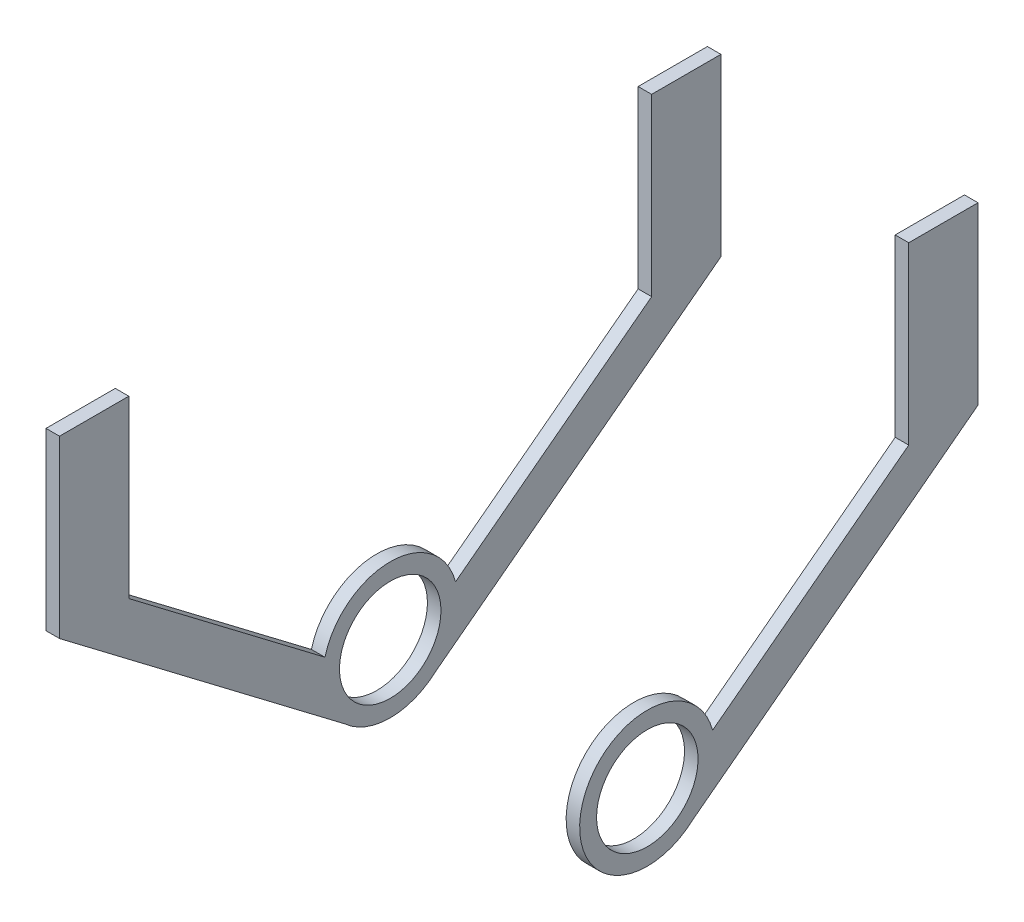
ISO-10303-21;
HEADER;
FILE_DESCRIPTION(('STEP AP214'),'2;1');
FILE_NAME('part.step','',(''),(''),'','','');
FILE_SCHEMA(('AUTOMOTIVE_DESIGN { 1 0 10303 214 1 1 1 1 }'));
ENDSEC;
DATA;
#1=APPLICATION_CONTEXT('core data for automotive mechanical design processes');
#2=APPLICATION_PROTOCOL_DEFINITION('international standard','automotive_design',2000,#1);
#3=PRODUCT_CONTEXT('',#1,'mechanical');
#4=PRODUCT('Part','Part','',(#3));
#5=PRODUCT_RELATED_PRODUCT_CATEGORY('part','',(#4));
#6=PRODUCT_DEFINITION_FORMATION('','',#4);
#7=PRODUCT_DEFINITION_CONTEXT('part definition',#1,'design');
#8=PRODUCT_DEFINITION('design','',#6,#7);
#9=PRODUCT_DEFINITION_SHAPE('','',#8);
#10=(LENGTH_UNIT() NAMED_UNIT(*) SI_UNIT(.MILLI.,.METRE.));
#11=(NAMED_UNIT(*) PLANE_ANGLE_UNIT() SI_UNIT($,.RADIAN.));
#12=(NAMED_UNIT(*) SI_UNIT($,.STERADIAN.) SOLID_ANGLE_UNIT());
#13=UNCERTAINTY_MEASURE_WITH_UNIT(LENGTH_MEASURE(1.E-05),#10,'distance_accuracy_value','');
#14=(GEOMETRIC_REPRESENTATION_CONTEXT(3) GLOBAL_UNCERTAINTY_ASSIGNED_CONTEXT((#13)) GLOBAL_UNIT_ASSIGNED_CONTEXT((#10,
#11,#12)) REPRESENTATION_CONTEXT('',''));
#15=CARTESIAN_POINT('',(0.,0.,0.));
#16=DIRECTION('',(0.,0.,1.));
#17=DIRECTION('',(1.,0.,0.));
#18=AXIS2_PLACEMENT_3D('',#15,#16,#17);
#19=CARTESIAN_POINT('',(190.,0.,1.32676290876039E-12));
#20=DIRECTION('',(1.,0.,0.));
#21=DIRECTION('',(0.,0.,-1.));
#22=AXIS2_PLACEMENT_3D('',#19,#20,#21);
#23=CYLINDRICAL_SURFACE('',#22,50.);
#24=DIRECTION('',(1.,0.,0.));
#25=VECTOR('',#24,1.);
#26=CARTESIAN_POINT('',(190.,12.9864956937927,-48.2840649655243));
#27=LINE('',#26,#25);
#28=CARTESIAN_POINT('',(190.,12.9864956937927,-48.2840649655243));
#29=VERTEX_POINT('',#28);
#30=CARTESIAN_POINT('',(200.,12.9864956937927,-48.2840649655243));
#31=VERTEX_POINT('',#30);
#32=EDGE_CURVE('E141',#29,#31,#27,.T.);
#33=ORIENTED_EDGE('',*,*,#32,.F.);
#34=CARTESIAN_POINT('',(190.,0.,1.32676290876039E-12));
#35=DIRECTION('',(-1.,0.,0.));
#36=DIRECTION('',(0.,0.,1.));
#37=AXIS2_PLACEMENT_3D('',#34,#35,#36);
#38=CIRCLE('',#37,50.);
#39=CARTESIAN_POINT('',(190.,-37.0135043062073,-33.6154800497373));
#40=VERTEX_POINT('',#39);
#41=EDGE_CURVE('E12',#40,#29,#38,.T.);
#42=ORIENTED_EDGE('',*,*,#41,.F.);
#43=DIRECTION('',(1.,0.,0.));
#44=VECTOR('',#43,1.);
#45=CARTESIAN_POINT('',(190.,-37.0135043062073,-33.6154800497373));
#46=LINE('',#45,#44);
#47=CARTESIAN_POINT('',(200.,-37.0135043062073,-33.6154800497372));
#48=VERTEX_POINT('',#47);
#49=EDGE_CURVE('E132',#40,#48,#46,.T.);
#50=ORIENTED_EDGE('',*,*,#49,.T.);
#51=CARTESIAN_POINT('',(200.,0.,1.39659253553725E-12));
#52=DIRECTION('',(-1.,0.,0.));
#53=DIRECTION('',(0.,0.,1.));
#54=AXIS2_PLACEMENT_3D('',#51,#52,#53);
#55=CIRCLE('',#54,50.);
#56=EDGE_CURVE('E46',#48,#31,#55,.T.);
#57=ORIENTED_EDGE('',*,*,#56,.T.);
#58=EDGE_LOOP('',(#33,#42,#50,#57));
#59=FACE_BOUND('',#58,.T.);
#60=ADVANCED_FACE('F43',(#59),#23,.T.);
#61=CARTESIAN_POINT('',(190.,0.,1.32676290876039E-12));
#62=DIRECTION('',(-1.,0.,0.));
#63=DIRECTION('',(0.,0.,1.));
#64=AXIS2_PLACEMENT_3D('',#61,#62,#63);
#65=PLANE('',#64);
#66=ORIENTED_EDGE('',*,*,#41,.T.);
#67=DIRECTION('',(0.,0.604592379297313,-0.796535030551459));
#68=VECTOR('',#67,1.);
#69=CARTESIAN_POINT('',(190.,12.9864956937927,-48.2840649655243));
#70=LINE('',#69,#68);
#71=CARTESIAN_POINT('',(190.000000000001,122.995180064618,-193.217699206968));
#72=VERTEX_POINT('',#71);
#73=EDGE_CURVE('E99',#29,#72,#70,.T.);
#74=ORIENTED_EDGE('',*,*,#73,.T.);
#75=DIRECTION('',(0.,1.,0.));
#76=VECTOR('',#75,1.);
#77=CARTESIAN_POINT('',(190.000000000001,122.995180064618,-193.217699206968));
#78=LINE('',#77,#76);
#79=CARTESIAN_POINT('',(190.000000000001,252.532858584818,-193.217699206968));
#80=VERTEX_POINT('',#79);
#81=EDGE_CURVE('E90',#72,#80,#78,.T.);
#82=ORIENTED_EDGE('',*,*,#81,.T.);
#83=DIRECTION('',(0.,0.,-1.));
#84=VECTOR('',#83,1.);
#85=CARTESIAN_POINT('',(190.000000000001,252.532858584818,-193.217699206968));
#86=LINE('',#85,#84);
#87=CARTESIAN_POINT('',(190.000000000002,252.532858584818,-244.42283829323));
#88=VERTEX_POINT('',#87);
#89=EDGE_CURVE('E96',#80,#88,#86,.T.);
#90=ORIENTED_EDGE('',*,*,#89,.T.);
#91=DIRECTION('',(0.,-1.,0.));
#92=VECTOR('',#91,1.);
#93=CARTESIAN_POINT('',(190.000000000002,122.995180064618,-244.42283829323));
#94=LINE('',#93,#92);
#95=CARTESIAN_POINT('',(190.000000000002,122.995180064618,-244.42283829323));
#96=VERTEX_POINT('',#95);
#97=EDGE_CURVE('E118',#88,#96,#94,.T.);
#98=ORIENTED_EDGE('',*,*,#97,.T.);
#99=DIRECTION('',(0.,-0.604592379297313,0.796535030551459));
#100=VECTOR('',#99,1.);
#101=CARTESIAN_POINT('',(190.,-37.0135043062073,-33.6154800497373));
#102=LINE('',#101,#100);
#103=EDGE_CURVE('E129',#96,#40,#102,.T.);
#104=ORIENTED_EDGE('',*,*,#103,.T.);
#105=EDGE_LOOP('',(#66,#74,#82,#90,#98,#104));
#106=FACE_BOUND('',#105,.T.);
#107=CARTESIAN_POINT('',(190.,0.,1.32676290876039E-12));
#108=DIRECTION('',(-1.,0.,0.));
#109=DIRECTION('',(0.,0.,1.));
#110=AXIS2_PLACEMENT_3D('',#107,#108,#109);
#111=CIRCLE('',#110,37.4999999999987);
#112=CARTESIAN_POINT('',(190.,0.,37.5));
#113=VERTEX_POINT('',#112);
#114=EDGE_CURVE('E145',#113,#113,#111,.T.);
#115=ORIENTED_EDGE('',*,*,#114,.F.);
#116=EDGE_LOOP('',(#115));
#117=FACE_BOUND('',#116,.T.);
#118=ADVANCED_FACE('F92',(#106,#117),#65,.T.);
#119=CARTESIAN_POINT('',(200.,0.,1.39659253553725E-12));
#120=DIRECTION('',(-1.,0.,0.));
#121=DIRECTION('',(0.,0.,1.));
#122=AXIS2_PLACEMENT_3D('',#119,#120,#121);
#123=PLANE('',#122);
#124=ORIENTED_EDGE('',*,*,#56,.F.);
#125=DIRECTION('',(0.,-0.604592379297313,0.796535030551459));
#126=VECTOR('',#125,1.);
#127=CARTESIAN_POINT('',(200.,-37.0135043062073,-33.6154800497372));
#128=LINE('',#127,#126);
#129=CARTESIAN_POINT('',(200.000000000002,122.995180064618,-244.422838293229));
#130=VERTEX_POINT('',#129);
#131=EDGE_CURVE('E130',#130,#48,#128,.T.);
#132=ORIENTED_EDGE('',*,*,#131,.F.);
#133=DIRECTION('',(0.,-1.,0.));
#134=VECTOR('',#133,1.);
#135=CARTESIAN_POINT('',(200.000000000002,122.995180064618,-244.422838293229));
#136=LINE('',#135,#134);
#137=CARTESIAN_POINT('',(200.000000000002,252.532858584818,-244.42283829323));
#138=VERTEX_POINT('',#137);
#139=EDGE_CURVE('E103',#138,#130,#136,.T.);
#140=ORIENTED_EDGE('',*,*,#139,.F.);
#141=DIRECTION('',(0.,0.,-1.));
#142=VECTOR('',#141,1.);
#143=CARTESIAN_POINT('',(200.000000000001,252.532858584818,-193.217699206968));
#144=LINE('',#143,#142);
#145=CARTESIAN_POINT('',(200.000000000001,252.532858584818,-193.217699206968));
#146=VERTEX_POINT('',#145);
#147=EDGE_CURVE('E123',#146,#138,#144,.T.);
#148=ORIENTED_EDGE('',*,*,#147,.F.);
#149=DIRECTION('',(0.,1.,0.));
#150=VECTOR('',#149,1.);
#151=CARTESIAN_POINT('',(200.000000000001,122.995180064618,-193.217699206968));
#152=LINE('',#151,#150);
#153=CARTESIAN_POINT('',(200.000000000001,122.995180064618,-193.217699206968));
#154=VERTEX_POINT('',#153);
#155=EDGE_CURVE('E109',#154,#146,#152,.T.);
#156=ORIENTED_EDGE('',*,*,#155,.F.);
#157=DIRECTION('',(0.,0.604592379297313,-0.796535030551459));
#158=VECTOR('',#157,1.);
#159=CARTESIAN_POINT('',(200.,12.9864956937927,-48.2840649655243));
#160=LINE('',#159,#158);
#161=EDGE_CURVE('E112',#31,#154,#160,.T.);
#162=ORIENTED_EDGE('',*,*,#161,.F.);
#163=EDGE_LOOP('',(#124,#132,#140,#148,#156,#162));
#164=FACE_BOUND('',#163,.T.);
#165=CARTESIAN_POINT('',(200.,0.,1.39659253553725E-12));
#166=DIRECTION('',(-1.,0.,0.));
#167=DIRECTION('',(0.,0.,1.));
#168=AXIS2_PLACEMENT_3D('',#165,#166,#167);
#169=CIRCLE('',#168,37.4999999999987);
#170=CARTESIAN_POINT('',(200.,0.,37.5000000000001));
#171=VERTEX_POINT('',#170);
#172=EDGE_CURVE('E144',#171,#171,#169,.T.);
#173=ORIENTED_EDGE('',*,*,#172,.T.);
#174=EDGE_LOOP('',(#173));
#175=FACE_BOUND('',#174,.T.);
#176=ADVANCED_FACE('F151',(#164,#175),#123,.F.);
#177=CARTESIAN_POINT('',(190.,0.,1.32676290876039E-12));
#178=DIRECTION('',(1.,0.,0.));
#179=DIRECTION('',(0.,0.,-1.));
#180=AXIS2_PLACEMENT_3D('',#177,#178,#179);
#181=CYLINDRICAL_SURFACE('',#180,37.4999999999987);
#182=ORIENTED_EDGE('',*,*,#114,.T.);
#183=EDGE_LOOP('',(#182));
#184=FACE_BOUND('',#183,.T.);
#185=ORIENTED_EDGE('',*,*,#172,.F.);
#186=EDGE_LOOP('',(#185));
#187=FACE_BOUND('',#186,.T.);
#188=ADVANCED_FACE('F153',(#184,#187),#181,.F.);
#189=CARTESIAN_POINT('',(190.,12.9864956937927,-48.2840649655243));
#190=DIRECTION('',(0.,-0.796535030551459,-0.604592379297313));
#191=DIRECTION('',(0.,0.604592379297313,-0.796535030551459));
#192=AXIS2_PLACEMENT_3D('',#189,#190,#191);
#193=PLANE('',#192);
#194=ORIENTED_EDGE('',*,*,#161,.T.);
#195=DIRECTION('',(1.,0.,0.));
#196=VECTOR('',#195,1.);
#197=CARTESIAN_POINT('',(190.000000000001,122.995180064618,-193.217699206968));
#198=LINE('',#197,#196);
#199=EDGE_CURVE('E139',#72,#154,#198,.T.);
#200=ORIENTED_EDGE('',*,*,#199,.F.);
#201=ORIENTED_EDGE('',*,*,#73,.F.);
#202=ORIENTED_EDGE('',*,*,#32,.T.);
#203=EDGE_LOOP('',(#194,#200,#201,#202));
#204=FACE_BOUND('',#203,.T.);
#205=ADVANCED_FACE('F155',(#204),#193,.F.);
#206=CARTESIAN_POINT('',(190.,-37.0135043062073,-33.6154800497373));
#207=DIRECTION('',(0.,0.796535030551459,0.604592379297313));
#208=DIRECTION('',(0.,-0.604592379297313,0.796535030551459));
#209=AXIS2_PLACEMENT_3D('',#206,#207,#208);
#210=PLANE('',#209);
#211=ORIENTED_EDGE('',*,*,#131,.T.);
#212=ORIENTED_EDGE('',*,*,#49,.F.);
#213=ORIENTED_EDGE('',*,*,#103,.F.);
#214=DIRECTION('',(1.,0.,0.));
#215=VECTOR('',#214,1.);
#216=CARTESIAN_POINT('',(190.000000000002,122.995180064618,-244.42283829323));
#217=LINE('',#216,#215);
#218=EDGE_CURVE('E137',#96,#130,#217,.T.);
#219=ORIENTED_EDGE('',*,*,#218,.T.);
#220=EDGE_LOOP('',(#211,#212,#213,#219));
#221=FACE_BOUND('',#220,.T.);
#222=ADVANCED_FACE('F162',(#221),#210,.F.);
#223=CARTESIAN_POINT('',(190.000000000001,122.995180064618,-193.217699206968));
#224=DIRECTION('',(0.,0.,-1.));
#225=DIRECTION('',(-1.,0.,0.));
#226=AXIS2_PLACEMENT_3D('',#223,#224,#225);
#227=PLANE('',#226);
#228=ORIENTED_EDGE('',*,*,#155,.T.);
#229=DIRECTION('',(1.,0.,0.));
#230=VECTOR('',#229,1.);
#231=CARTESIAN_POINT('',(190.000000000001,252.532858584818,-193.217699206968));
#232=LINE('',#231,#230);
#233=EDGE_CURVE('E106',#80,#146,#232,.T.);
#234=ORIENTED_EDGE('',*,*,#233,.F.);
#235=ORIENTED_EDGE('',*,*,#81,.F.);
#236=ORIENTED_EDGE('',*,*,#199,.T.);
#237=EDGE_LOOP('',(#228,#234,#235,#236));
#238=FACE_BOUND('',#237,.T.);
#239=ADVANCED_FACE('F107',(#238),#227,.F.);
#240=CARTESIAN_POINT('',(190.000000000001,252.532858584818,-193.217699206968));
#241=DIRECTION('',(0.,-1.,0.));
#242=DIRECTION('',(0.,0.,-1.));
#243=AXIS2_PLACEMENT_3D('',#240,#241,#242);
#244=PLANE('',#243);
#245=ORIENTED_EDGE('',*,*,#147,.T.);
#246=DIRECTION('',(1.,0.,0.));
#247=VECTOR('',#246,1.);
#248=CARTESIAN_POINT('',(190.000000000002,252.532858584818,-244.42283829323));
#249=LINE('',#248,#247);
#250=EDGE_CURVE('E113',#88,#138,#249,.T.);
#251=ORIENTED_EDGE('',*,*,#250,.F.);
#252=ORIENTED_EDGE('',*,*,#89,.F.);
#253=ORIENTED_EDGE('',*,*,#233,.T.);
#254=EDGE_LOOP('',(#245,#251,#252,#253));
#255=FACE_BOUND('',#254,.T.);
#256=ADVANCED_FACE('F115',(#255),#244,.F.);
#257=CARTESIAN_POINT('',(190.000000000002,122.995180064618,-244.42283829323));
#258=DIRECTION('',(0.,0.,1.));
#259=DIRECTION('',(1.,0.,0.));
#260=AXIS2_PLACEMENT_3D('',#257,#258,#259);
#261=PLANE('',#260);
#262=ORIENTED_EDGE('',*,*,#139,.T.);
#263=ORIENTED_EDGE('',*,*,#218,.F.);
#264=ORIENTED_EDGE('',*,*,#97,.F.);
#265=ORIENTED_EDGE('',*,*,#250,.T.);
#266=EDGE_LOOP('',(#262,#263,#264,#265));
#267=FACE_BOUND('',#266,.T.);
#268=ADVANCED_FACE('F175',(#267),#261,.F.);
#269=CLOSED_SHELL('',(#60,#118,#176,#188,#205,#222,#239,#256,#268));
#270=MANIFOLD_SOLID_BREP('B2',#269);
#271=CARTESIAN_POINT('',(10.,0.,0.));
#272=DIRECTION('',(-1.,0.,0.));
#273=DIRECTION('',(0.,0.,1.));
#274=AXIS2_PLACEMENT_3D('',#271,#272,#273);
#275=CYLINDRICAL_SURFACE('',#274,50.);
#276=CARTESIAN_POINT('',(0.,0.,0.));
#277=DIRECTION('',(1.,0.,0.));
#278=DIRECTION('',(0.,0.,-1.));
#279=AXIS2_PLACEMENT_3D('',#276,#277,#278);
#280=CIRCLE('',#279,50.);
#281=CARTESIAN_POINT('',(0.,-37.0135043062073,33.6154800497386));
#282=VERTEX_POINT('',#281);
#283=CARTESIAN_POINT('',(0.,-37.0135043062073,-33.6154800497386));
#284=VERTEX_POINT('',#283);
#285=EDGE_CURVE('E256',#282,#284,#280,.T.);
#286=ORIENTED_EDGE('',*,*,#285,.T.);
#287=DIRECTION('',(-1.,0.,0.));
#288=VECTOR('',#287,1.);
#289=CARTESIAN_POINT('',(10.,-37.0135043062073,-33.6154800497386));
#290=LINE('',#289,#288);
#291=CARTESIAN_POINT('',(10.,-37.0135043062073,-33.6154800497386));
#292=VERTEX_POINT('',#291);
#293=EDGE_CURVE('E275',#292,#284,#290,.T.);
#294=ORIENTED_EDGE('',*,*,#293,.F.);
#295=CARTESIAN_POINT('',(10.,0.,0.));
#296=DIRECTION('',(1.,0.,0.));
#297=DIRECTION('',(0.,0.,-1.));
#298=AXIS2_PLACEMENT_3D('',#295,#296,#297);
#299=CIRCLE('',#298,50.);
#300=CARTESIAN_POINT('',(10.,-37.0135043062073,33.6154800497386));
#301=VERTEX_POINT('',#300);
#302=EDGE_CURVE('E41',#301,#292,#299,.T.);
#303=ORIENTED_EDGE('',*,*,#302,.F.);
#304=DIRECTION('',(-1.,0.,0.));
#305=VECTOR('',#304,1.);
#306=CARTESIAN_POINT('',(10.,-37.0135043062073,33.6154800497386));
#307=LINE('',#306,#305);
#308=EDGE_CURVE('E408',#301,#282,#307,.T.);
#309=ORIENTED_EDGE('',*,*,#308,.T.);
#310=EDGE_LOOP('',(#286,#294,#303,#309));
#311=FACE_BOUND('',#310,.T.);
#312=ADVANCED_FACE('F252',(#311),#275,.T.);
#313=CARTESIAN_POINT('',(10.,12.9864956937927,-48.2840649655257));
#314=VERTEX_POINT('',#313);
#315=CARTESIAN_POINT('',(10.,12.9864956937927,48.2840649655257));
#316=VERTEX_POINT('',#315);
#317=EDGE_CURVE('E261',#314,#316,#299,.T.);
#318=ORIENTED_EDGE('',*,*,#317,.F.);
#319=DIRECTION('',(-1.,0.,0.));
#320=VECTOR('',#319,1.);
#321=CARTESIAN_POINT('',(10.,12.9864956937927,-48.2840649655257));
#322=LINE('',#321,#320);
#323=CARTESIAN_POINT('',(0.,12.9864956937927,-48.2840649655257));
#324=VERTEX_POINT('',#323);
#325=EDGE_CURVE('E370',#314,#324,#322,.T.);
#326=ORIENTED_EDGE('',*,*,#325,.T.);
#327=CARTESIAN_POINT('',(0.,12.9864956937927,48.2840649655257));
#328=VERTEX_POINT('',#327);
#329=EDGE_CURVE('E426',#324,#328,#280,.T.);
#330=ORIENTED_EDGE('',*,*,#329,.T.);
#331=DIRECTION('',(-1.,0.,0.));
#332=VECTOR('',#331,1.);
#333=CARTESIAN_POINT('',(10.,12.9864956937927,48.2840649655257));
#334=LINE('',#333,#332);
#335=EDGE_CURVE('E419',#316,#328,#334,.T.);
#336=ORIENTED_EDGE('',*,*,#335,.F.);
#337=EDGE_LOOP('',(#318,#326,#330,#336));
#338=FACE_BOUND('',#337,.T.);
#339=ADVANCED_FACE('F254',(#338),#275,.T.);
#340=CARTESIAN_POINT('',(10.,0.,0.));
#341=DIRECTION('',(1.,0.,0.));
#342=DIRECTION('',(0.,0.,-1.));
#343=AXIS2_PLACEMENT_3D('',#340,#341,#342);
#344=PLANE('',#343);
#345=ORIENTED_EDGE('',*,*,#302,.T.);
#346=DIRECTION('',(0.,-0.604592379297313,0.796535030551459));
#347=VECTOR('',#346,1.);
#348=CARTESIAN_POINT('',(10.,-37.0135043062073,-33.6154800497386));
#349=LINE('',#348,#347);
#350=CARTESIAN_POINT('',(10.,122.995180064618,-244.422838293231));
#351=VERTEX_POINT('',#350);
#352=EDGE_CURVE('E358',#351,#292,#349,.T.);
#353=ORIENTED_EDGE('',*,*,#352,.F.);
#354=DIRECTION('',(0.,-1.,0.));
#355=VECTOR('',#354,1.);
#356=CARTESIAN_POINT('',(10.,122.995180064618,-244.422838293231));
#357=LINE('',#356,#355);
#358=CARTESIAN_POINT('',(10.,252.532858584818,-244.422838293231));
#359=VERTEX_POINT('',#358);
#360=EDGE_CURVE('E340',#359,#351,#357,.T.);
#361=ORIENTED_EDGE('',*,*,#360,.F.);
#362=DIRECTION('',(0.,0.,-1.));
#363=VECTOR('',#362,1.);
#364=CARTESIAN_POINT('',(10.,252.532858584818,-244.422838293231));
#365=LINE('',#364,#363);
#366=CARTESIAN_POINT('',(10.,252.532858584818,-193.217699206969));
#367=VERTEX_POINT('',#366);
#368=EDGE_CURVE('E351',#367,#359,#365,.T.);
#369=ORIENTED_EDGE('',*,*,#368,.F.);
#370=DIRECTION('',(0.,1.,0.));
#371=VECTOR('',#370,1.);
#372=CARTESIAN_POINT('',(10.,122.995180064618,-193.217699206969));
#373=LINE('',#372,#371);
#374=CARTESIAN_POINT('',(10.,122.995180064618,-193.217699206969));
#375=VERTEX_POINT('',#374);
#376=EDGE_CURVE('E460',#375,#367,#373,.T.);
#377=ORIENTED_EDGE('',*,*,#376,.F.);
#378=DIRECTION('',(0.,0.604592379297313,-0.796535030551459));
#379=VECTOR('',#378,1.);
#380=CARTESIAN_POINT('',(10.,12.9864956937927,-48.2840649655257));
#381=LINE('',#380,#379);
#382=EDGE_CURVE('E366',#314,#375,#381,.T.);
#383=ORIENTED_EDGE('',*,*,#382,.F.);
#384=ORIENTED_EDGE('',*,*,#317,.T.);
#385=DIRECTION('',(0.,0.604592379297313,0.796535030551459));
#386=VECTOR('',#385,1.);
#387=CARTESIAN_POINT('',(10.,12.9864956937927,48.2840649655257));
#388=LINE('',#387,#386);
#389=CARTESIAN_POINT('',(10.,122.995180064618,193.217699206969));
#390=VERTEX_POINT('',#389);
#391=EDGE_CURVE('E403',#316,#390,#388,.T.);
#392=ORIENTED_EDGE('',*,*,#391,.T.);
#393=DIRECTION('',(0.,1.,0.));
#394=VECTOR('',#393,1.);
#395=CARTESIAN_POINT('',(10.,122.995180064618,193.217699206969));
#396=LINE('',#395,#394);
#397=CARTESIAN_POINT('',(10.,252.532858584818,193.217699206969));
#398=VERTEX_POINT('',#397);
#399=EDGE_CURVE('E383',#390,#398,#396,.T.);
#400=ORIENTED_EDGE('',*,*,#399,.T.);
#401=DIRECTION('',(0.,0.,1.));
#402=VECTOR('',#401,1.);
#403=CARTESIAN_POINT('',(10.,252.532858584818,244.422838293231));
#404=LINE('',#403,#402);
#405=CARTESIAN_POINT('',(10.,252.532858584818,244.422838293231));
#406=VERTEX_POINT('',#405);
#407=EDGE_CURVE('E385',#398,#406,#404,.T.);
#408=ORIENTED_EDGE('',*,*,#407,.T.);
#409=DIRECTION('',(0.,-1.,0.));
#410=VECTOR('',#409,1.);
#411=CARTESIAN_POINT('',(10.,122.995180064618,244.422838293231));
#412=LINE('',#411,#410);
#413=CARTESIAN_POINT('',(10.,122.995180064618,244.422838293231));
#414=VERTEX_POINT('',#413);
#415=EDGE_CURVE('E388',#406,#414,#412,.T.);
#416=ORIENTED_EDGE('',*,*,#415,.T.);
#417=DIRECTION('',(0.,-0.604592379297313,-0.796535030551459));
#418=VECTOR('',#417,1.);
#419=CARTESIAN_POINT('',(10.,-37.0135043062073,33.6154800497386));
#420=LINE('',#419,#418);
#421=EDGE_CURVE('E405',#414,#301,#420,.T.);
#422=ORIENTED_EDGE('',*,*,#421,.T.);
#423=EDGE_LOOP('',(#345,#353,#361,#369,#377,#383,#384,#392,#400,#408,#416,#422));
#424=FACE_BOUND('',#423,.T.);
#425=CARTESIAN_POINT('',(10.,0.,0.));
#426=DIRECTION('',(1.,0.,0.));
#427=DIRECTION('',(0.,0.,-1.));
#428=AXIS2_PLACEMENT_3D('',#425,#426,#427);
#429=CIRCLE('',#428,37.5);
#430=CARTESIAN_POINT('',(10.,0.,-37.5));
#431=VERTEX_POINT('',#430);
#432=EDGE_CURVE('E423',#431,#431,#429,.T.);
#433=ORIENTED_EDGE('',*,*,#432,.F.);
#434=EDGE_LOOP('',(#433));
#435=FACE_BOUND('',#434,.T.);
#436=ADVANCED_FACE('F363',(#424,#435),#344,.T.);
#437=CARTESIAN_POINT('',(0.,0.,0.));
#438=DIRECTION('',(1.,0.,0.));
#439=DIRECTION('',(0.,0.,-1.));
#440=AXIS2_PLACEMENT_3D('',#437,#438,#439);
#441=PLANE('',#440);
#442=ORIENTED_EDGE('',*,*,#285,.F.);
#443=DIRECTION('',(0.,-0.604592379297313,-0.796535030551459));
#444=VECTOR('',#443,1.);
#445=CARTESIAN_POINT('',(0.,-37.0135043062073,33.6154800497386));
#446=LINE('',#445,#444);
#447=CARTESIAN_POINT('',(0.,122.995180064618,244.422838293231));
#448=VERTEX_POINT('',#447);
#449=EDGE_CURVE('E406',#448,#282,#446,.T.);
#450=ORIENTED_EDGE('',*,*,#449,.F.);
#451=DIRECTION('',(0.,-1.,0.));
#452=VECTOR('',#451,1.);
#453=CARTESIAN_POINT('',(0.,122.995180064618,244.422838293231));
#454=LINE('',#453,#452);
#455=CARTESIAN_POINT('',(0.,252.532858584818,244.422838293231));
#456=VERTEX_POINT('',#455);
#457=EDGE_CURVE('E386',#456,#448,#454,.T.);
#458=ORIENTED_EDGE('',*,*,#457,.F.);
#459=DIRECTION('',(0.,0.,1.));
#460=VECTOR('',#459,1.);
#461=CARTESIAN_POINT('',(0.,252.532858584818,244.422838293231));
#462=LINE('',#461,#460);
#463=CARTESIAN_POINT('',(0.,252.532858584818,193.217699206969));
#464=VERTEX_POINT('',#463);
#465=EDGE_CURVE('E393',#464,#456,#462,.T.);
#466=ORIENTED_EDGE('',*,*,#465,.F.);
#467=DIRECTION('',(0.,1.,0.));
#468=VECTOR('',#467,1.);
#469=CARTESIAN_POINT('',(0.,122.995180064618,193.217699206969));
#470=LINE('',#469,#468);
#471=CARTESIAN_POINT('',(0.,122.995180064618,193.217699206969));
#472=VERTEX_POINT('',#471);
#473=EDGE_CURVE('E382',#472,#464,#470,.T.);
#474=ORIENTED_EDGE('',*,*,#473,.F.);
#475=DIRECTION('',(0.,0.604592379297313,0.796535030551459));
#476=VECTOR('',#475,1.);
#477=CARTESIAN_POINT('',(0.,12.9864956937927,48.2840649655257));
#478=LINE('',#477,#476);
#479=EDGE_CURVE('E402',#328,#472,#478,.T.);
#480=ORIENTED_EDGE('',*,*,#479,.F.);
#481=ORIENTED_EDGE('',*,*,#329,.F.);
#482=DIRECTION('',(0.,0.604592379297313,-0.796535030551459));
#483=VECTOR('',#482,1.);
#484=CARTESIAN_POINT('',(0.,12.9864956937927,-48.2840649655257));
#485=LINE('',#484,#483);
#486=CARTESIAN_POINT('',(0.,122.995180064618,-193.217699206969));
#487=VERTEX_POINT('',#486);
#488=EDGE_CURVE('E367',#324,#487,#485,.T.);
#489=ORIENTED_EDGE('',*,*,#488,.T.);
#490=DIRECTION('',(0.,1.,0.));
#491=VECTOR('',#490,1.);
#492=CARTESIAN_POINT('',(0.,122.995180064618,-193.217699206969));
#493=LINE('',#492,#491);
#494=CARTESIAN_POINT('',(0.,252.532858584818,-193.217699206969));
#495=VERTEX_POINT('',#494);
#496=EDGE_CURVE('E352',#487,#495,#493,.T.);
#497=ORIENTED_EDGE('',*,*,#496,.T.);
#498=DIRECTION('',(0.,0.,-1.));
#499=VECTOR('',#498,1.);
#500=CARTESIAN_POINT('',(0.,252.532858584818,-244.422838293231));
#501=LINE('',#500,#499);
#502=CARTESIAN_POINT('',(0.,252.532858584818,-244.422838293231));
#503=VERTEX_POINT('',#502);
#504=EDGE_CURVE('E456',#495,#503,#501,.T.);
#505=ORIENTED_EDGE('',*,*,#504,.T.);
#506=DIRECTION('',(0.,-1.,0.));
#507=VECTOR('',#506,1.);
#508=CARTESIAN_POINT('',(0.,122.995180064618,-244.422838293231));
#509=LINE('',#508,#507);
#510=CARTESIAN_POINT('',(0.,122.995180064618,-244.422838293231));
#511=VERTEX_POINT('',#510);
#512=EDGE_CURVE('E453',#503,#511,#509,.T.);
#513=ORIENTED_EDGE('',*,*,#512,.T.);
#514=DIRECTION('',(0.,-0.604592379297313,0.796535030551459));
#515=VECTOR('',#514,1.);
#516=CARTESIAN_POINT('',(0.,-37.0135043062073,-33.6154800497386));
#517=LINE('',#516,#515);
#518=EDGE_CURVE('E360',#511,#284,#517,.T.);
#519=ORIENTED_EDGE('',*,*,#518,.T.);
#520=EDGE_LOOP('',(#442,#450,#458,#466,#474,#480,#481,#489,#497,#505,#513,#519));
#521=FACE_BOUND('',#520,.T.);
#522=CARTESIAN_POINT('',(0.,0.,0.));
#523=DIRECTION('',(1.,0.,0.));
#524=DIRECTION('',(0.,0.,-1.));
#525=AXIS2_PLACEMENT_3D('',#522,#523,#524);
#526=CIRCLE('',#525,37.5);
#527=CARTESIAN_POINT('',(0.,0.,-37.5));
#528=VERTEX_POINT('',#527);
#529=EDGE_CURVE('E422',#528,#528,#526,.T.);
#530=ORIENTED_EDGE('',*,*,#529,.T.);
#531=EDGE_LOOP('',(#530));
#532=FACE_BOUND('',#531,.T.);
#533=ADVANCED_FACE('F430',(#521,#532),#441,.F.);
#534=CARTESIAN_POINT('',(10.,0.,0.));
#535=DIRECTION('',(-1.,0.,0.));
#536=DIRECTION('',(0.,0.,1.));
#537=AXIS2_PLACEMENT_3D('',#534,#535,#536);
#538=CYLINDRICAL_SURFACE('',#537,37.5);
#539=ORIENTED_EDGE('',*,*,#432,.T.);
#540=EDGE_LOOP('',(#539));
#541=FACE_BOUND('',#540,.T.);
#542=ORIENTED_EDGE('',*,*,#529,.F.);
#543=EDGE_LOOP('',(#542));
#544=FACE_BOUND('',#543,.T.);
#545=ADVANCED_FACE('F432',(#541,#544),#538,.F.);
#546=CARTESIAN_POINT('',(10.,12.9864956937927,48.2840649655257));
#547=DIRECTION('',(0.,-0.796535030551459,0.604592379297313));
#548=DIRECTION('',(0.,-0.604592379297313,-0.796535030551459));
#549=AXIS2_PLACEMENT_3D('',#546,#547,#548);
#550=PLANE('',#549);
#551=ORIENTED_EDGE('',*,*,#479,.T.);
#552=DIRECTION('',(-1.,0.,0.));
#553=VECTOR('',#552,1.);
#554=CARTESIAN_POINT('',(10.,122.995180064618,193.217699206969));
#555=LINE('',#554,#553);
#556=EDGE_CURVE('E416',#390,#472,#555,.T.);
#557=ORIENTED_EDGE('',*,*,#556,.F.);
#558=ORIENTED_EDGE('',*,*,#391,.F.);
#559=ORIENTED_EDGE('',*,*,#335,.T.);
#560=EDGE_LOOP('',(#551,#557,#558,#559));
#561=FACE_BOUND('',#560,.T.);
#562=ADVANCED_FACE('F434',(#561),#550,.F.);
#563=CARTESIAN_POINT('',(10.,-37.0135043062073,33.6154800497386));
#564=DIRECTION('',(0.,0.796535030551459,-0.604592379297313));
#565=DIRECTION('',(0.,0.604592379297313,0.796535030551459));
#566=AXIS2_PLACEMENT_3D('',#563,#564,#565);
#567=PLANE('',#566);
#568=ORIENTED_EDGE('',*,*,#449,.T.);
#569=ORIENTED_EDGE('',*,*,#308,.F.);
#570=ORIENTED_EDGE('',*,*,#421,.F.);
#571=DIRECTION('',(-1.,0.,0.));
#572=VECTOR('',#571,1.);
#573=CARTESIAN_POINT('',(10.,122.995180064618,244.422838293231));
#574=LINE('',#573,#572);
#575=EDGE_CURVE('E414',#414,#448,#574,.T.);
#576=ORIENTED_EDGE('',*,*,#575,.T.);
#577=EDGE_LOOP('',(#568,#569,#570,#576));
#578=FACE_BOUND('',#577,.T.);
#579=ADVANCED_FACE('F441',(#578),#567,.F.);
#580=CARTESIAN_POINT('',(10.,122.995180064618,193.217699206969));
#581=DIRECTION('',(0.,0.,1.));
#582=DIRECTION('',(1.,0.,0.));
#583=AXIS2_PLACEMENT_3D('',#580,#581,#582);
#584=PLANE('',#583);
#585=ORIENTED_EDGE('',*,*,#473,.T.);
#586=DIRECTION('',(-1.,0.,0.));
#587=VECTOR('',#586,1.);
#588=CARTESIAN_POINT('',(10.,252.532858584818,193.217699206969));
#589=LINE('',#588,#587);
#590=EDGE_CURVE('E399',#398,#464,#589,.T.);
#591=ORIENTED_EDGE('',*,*,#590,.F.);
#592=ORIENTED_EDGE('',*,*,#399,.F.);
#593=ORIENTED_EDGE('',*,*,#556,.T.);
#594=EDGE_LOOP('',(#585,#591,#592,#593));
#595=FACE_BOUND('',#594,.T.);
#596=ADVANCED_FACE('F483',(#595),#584,.F.);
#597=CARTESIAN_POINT('',(10.,252.532858584818,244.422838293231));
#598=DIRECTION('',(0.,-1.,0.));
#599=DIRECTION('',(0.,0.,-1.));
#600=AXIS2_PLACEMENT_3D('',#597,#598,#599);
#601=PLANE('',#600);
#602=ORIENTED_EDGE('',*,*,#465,.T.);
#603=DIRECTION('',(-1.,0.,0.));
#604=VECTOR('',#603,1.);
#605=CARTESIAN_POINT('',(10.,252.532858584818,244.422838293231));
#606=LINE('',#605,#604);
#607=EDGE_CURVE('E391',#406,#456,#606,.T.);
#608=ORIENTED_EDGE('',*,*,#607,.F.);
#609=ORIENTED_EDGE('',*,*,#407,.F.);
#610=ORIENTED_EDGE('',*,*,#590,.T.);
#611=EDGE_LOOP('',(#602,#608,#609,#610));
#612=FACE_BOUND('',#611,.T.);
#613=ADVANCED_FACE('F485',(#612),#601,.F.);
#614=CARTESIAN_POINT('',(10.,122.995180064618,244.422838293231));
#615=DIRECTION('',(0.,0.,-1.));
#616=DIRECTION('',(-1.,0.,0.));
#617=AXIS2_PLACEMENT_3D('',#614,#615,#616);
#618=PLANE('',#617);
#619=ORIENTED_EDGE('',*,*,#457,.T.);
#620=ORIENTED_EDGE('',*,*,#575,.F.);
#621=ORIENTED_EDGE('',*,*,#415,.F.);
#622=ORIENTED_EDGE('',*,*,#607,.T.);
#623=EDGE_LOOP('',(#619,#620,#621,#622));
#624=FACE_BOUND('',#623,.T.);
#625=ADVANCED_FACE('F490',(#624),#618,.F.);
#626=CARTESIAN_POINT('',(10.,-37.0135043062073,-33.6154800497386));
#627=DIRECTION('',(0.,-0.796535030551459,-0.604592379297313));
#628=DIRECTION('',(0.,0.604592379297313,-0.796535030551459));
#629=AXIS2_PLACEMENT_3D('',#626,#627,#628);
#630=PLANE('',#629);
#631=ORIENTED_EDGE('',*,*,#518,.F.);
#632=DIRECTION('',(-1.,0.,0.));
#633=VECTOR('',#632,1.);
#634=CARTESIAN_POINT('',(10.,122.995180064618,-244.422838293231));
#635=LINE('',#634,#633);
#636=EDGE_CURVE('E344',#351,#511,#635,.T.);
#637=ORIENTED_EDGE('',*,*,#636,.F.);
#638=ORIENTED_EDGE('',*,*,#352,.T.);
#639=ORIENTED_EDGE('',*,*,#293,.T.);
#640=EDGE_LOOP('',(#631,#637,#638,#639));
#641=FACE_BOUND('',#640,.T.);
#642=ADVANCED_FACE('F357',(#641),#630,.T.);
#643=CARTESIAN_POINT('',(10.,12.9864956937927,-48.2840649655257));
#644=DIRECTION('',(0.,0.796535030551459,0.604592379297313));
#645=DIRECTION('',(0.,-0.604592379297313,0.796535030551459));
#646=AXIS2_PLACEMENT_3D('',#643,#644,#645);
#647=PLANE('',#646);
#648=ORIENTED_EDGE('',*,*,#488,.F.);
#649=ORIENTED_EDGE('',*,*,#325,.F.);
#650=ORIENTED_EDGE('',*,*,#382,.T.);
#651=DIRECTION('',(-1.,0.,0.));
#652=VECTOR('',#651,1.);
#653=CARTESIAN_POINT('',(10.,122.995180064618,-193.217699206969));
#654=LINE('',#653,#652);
#655=EDGE_CURVE('E361',#375,#487,#654,.T.);
#656=ORIENTED_EDGE('',*,*,#655,.T.);
#657=EDGE_LOOP('',(#648,#649,#650,#656));
#658=FACE_BOUND('',#657,.T.);
#659=ADVANCED_FACE('F472',(#658),#647,.T.);
#660=CARTESIAN_POINT('',(10.,122.995180064618,-244.422838293231));
#661=DIRECTION('',(0.,0.,-1.));
#662=DIRECTION('',(-1.,0.,0.));
#663=AXIS2_PLACEMENT_3D('',#660,#661,#662);
#664=PLANE('',#663);
#665=ORIENTED_EDGE('',*,*,#512,.F.);
#666=DIRECTION('',(-1.,0.,0.));
#667=VECTOR('',#666,1.);
#668=CARTESIAN_POINT('',(10.,252.532858584818,-244.422838293231));
#669=LINE('',#668,#667);
#670=EDGE_CURVE('E346',#359,#503,#669,.T.);
#671=ORIENTED_EDGE('',*,*,#670,.F.);
#672=ORIENTED_EDGE('',*,*,#360,.T.);
#673=ORIENTED_EDGE('',*,*,#636,.T.);
#674=EDGE_LOOP('',(#665,#671,#672,#673));
#675=FACE_BOUND('',#674,.T.);
#676=ADVANCED_FACE('F343',(#675),#664,.T.);
#677=CARTESIAN_POINT('',(10.,252.532858584818,-244.422838293231));
#678=DIRECTION('',(0.,1.,0.));
#679=DIRECTION('',(0.,0.,1.));
#680=AXIS2_PLACEMENT_3D('',#677,#678,#679);
#681=PLANE('',#680);
#682=ORIENTED_EDGE('',*,*,#504,.F.);
#683=DIRECTION('',(-1.,0.,0.));
#684=VECTOR('',#683,1.);
#685=CARTESIAN_POINT('',(10.,252.532858584818,-193.217699206969));
#686=LINE('',#685,#684);
#687=EDGE_CURVE('E463',#367,#495,#686,.T.);
#688=ORIENTED_EDGE('',*,*,#687,.F.);
#689=ORIENTED_EDGE('',*,*,#368,.T.);
#690=ORIENTED_EDGE('',*,*,#670,.T.);
#691=EDGE_LOOP('',(#682,#688,#689,#690));
#692=FACE_BOUND('',#691,.T.);
#693=ADVANCED_FACE('F468',(#692),#681,.T.);
#694=CARTESIAN_POINT('',(10.,122.995180064618,-193.217699206969));
#695=DIRECTION('',(0.,0.,1.));
#696=DIRECTION('',(1.,0.,0.));
#697=AXIS2_PLACEMENT_3D('',#694,#695,#696);
#698=PLANE('',#697);
#699=ORIENTED_EDGE('',*,*,#496,.F.);
#700=ORIENTED_EDGE('',*,*,#655,.F.);
#701=ORIENTED_EDGE('',*,*,#376,.T.);
#702=ORIENTED_EDGE('',*,*,#687,.T.);
#703=EDGE_LOOP('',(#699,#700,#701,#702));
#704=FACE_BOUND('',#703,.T.);
#705=ADVANCED_FACE('F511',(#704),#698,.T.);
#706=CLOSED_SHELL('',(#312,#339,#436,#533,#545,#562,#579,#596,#613,#625,#642,#659,#676,#693,#705));
#707=MANIFOLD_SOLID_BREP('B6',#706);
#708=ADVANCED_BREP_SHAPE_REPRESENTATION('',(#18,#270,#707),#14);
#709=SHAPE_DEFINITION_REPRESENTATION(#9,#708);
ENDSEC;
END-ISO-10303-21;
